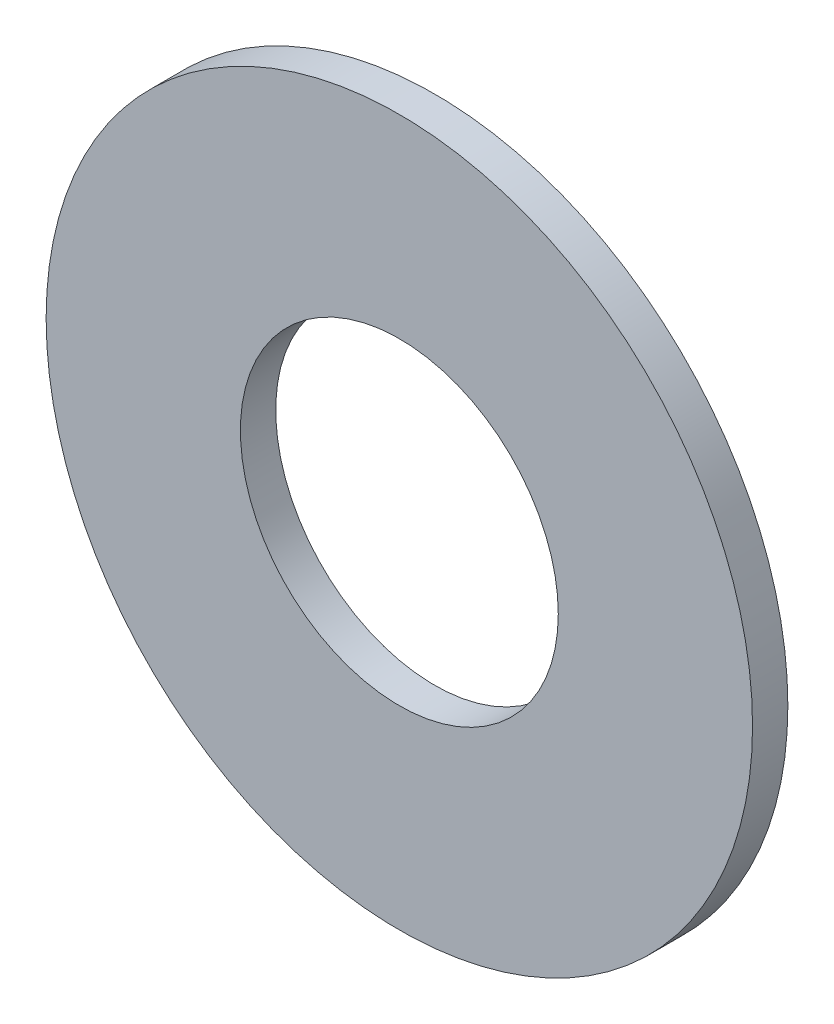
ISO-10303-21;
HEADER;
FILE_DESCRIPTION(('STEP AP214'),'2;1');
FILE_NAME('part.step','',(''),(''),'','','');
FILE_SCHEMA(('AUTOMOTIVE_DESIGN { 1 0 10303 214 1 1 1 1 }'));
ENDSEC;
DATA;
#1=APPLICATION_CONTEXT('core data for automotive mechanical design processes');
#2=APPLICATION_PROTOCOL_DEFINITION('international standard','automotive_design',2000,#1);
#3=PRODUCT_CONTEXT('',#1,'mechanical');
#4=PRODUCT('Part','Part','',(#3));
#5=PRODUCT_RELATED_PRODUCT_CATEGORY('part','',(#4));
#6=PRODUCT_DEFINITION_FORMATION('','',#4);
#7=PRODUCT_DEFINITION_CONTEXT('part definition',#1,'design');
#8=PRODUCT_DEFINITION('design','',#6,#7);
#9=PRODUCT_DEFINITION_SHAPE('','',#8);
#10=(LENGTH_UNIT() NAMED_UNIT(*) SI_UNIT(.MILLI.,.METRE.));
#11=(NAMED_UNIT(*) PLANE_ANGLE_UNIT() SI_UNIT($,.RADIAN.));
#12=(NAMED_UNIT(*) SI_UNIT($,.STERADIAN.) SOLID_ANGLE_UNIT());
#13=UNCERTAINTY_MEASURE_WITH_UNIT(LENGTH_MEASURE(1.E-05),#10,'distance_accuracy_value','');
#14=(GEOMETRIC_REPRESENTATION_CONTEXT(3) GLOBAL_UNCERTAINTY_ASSIGNED_CONTEXT((#13)) GLOBAL_UNIT_ASSIGNED_CONTEXT((#10,
#11,#12)) REPRESENTATION_CONTEXT('',''));
#15=CARTESIAN_POINT('',(0.,0.,0.));
#16=DIRECTION('',(0.,0.,1.));
#17=DIRECTION('',(1.,0.,0.));
#18=AXIS2_PLACEMENT_3D('',#15,#16,#17);
#19=CARTESIAN_POINT('',(0.,0.,-1.));
#20=DIRECTION('',(0.,0.,1.));
#21=DIRECTION('',(1.,0.,0.));
#22=AXIS2_PLACEMENT_3D('',#19,#20,#21);
#23=CYLINDRICAL_SURFACE('',#22,10.);
#24=CARTESIAN_POINT('',(0.,0.,-1.));
#25=DIRECTION('',(0.,0.,1.));
#26=DIRECTION('',(1.,0.,0.));
#27=AXIS2_PLACEMENT_3D('',#24,#25,#26);
#28=CIRCLE('',#27,10.);
#29=CARTESIAN_POINT('',(10.,0.,-1.));
#30=VERTEX_POINT('',#29);
#31=EDGE_CURVE('E10',#30,#30,#28,.T.);
#32=ORIENTED_EDGE('',*,*,#31,.T.);
#33=EDGE_LOOP('',(#32));
#34=FACE_BOUND('',#33,.T.);
#35=CARTESIAN_POINT('',(0.,0.,0.));
#36=DIRECTION('',(0.,0.,1.));
#37=DIRECTION('',(1.,0.,0.));
#38=AXIS2_PLACEMENT_3D('',#35,#36,#37);
#39=CIRCLE('',#38,10.);
#40=CARTESIAN_POINT('',(10.,0.,0.));
#41=VERTEX_POINT('',#40);
#42=EDGE_CURVE('E34',#41,#41,#39,.T.);
#43=ORIENTED_EDGE('',*,*,#42,.F.);
#44=EDGE_LOOP('',(#43));
#45=FACE_BOUND('',#44,.T.);
#46=ADVANCED_FACE('F31',(#34,#45),#23,.T.);
#47=CARTESIAN_POINT('',(0.,0.,-1.));
#48=DIRECTION('',(0.,0.,1.));
#49=DIRECTION('',(1.,0.,0.));
#50=AXIS2_PLACEMENT_3D('',#47,#48,#49);
#51=PLANE('',#50);
#52=CARTESIAN_POINT('',(0.,0.,-1.));
#53=DIRECTION('',(0.,0.,1.));
#54=DIRECTION('',(1.,0.,0.));
#55=AXIS2_PLACEMENT_3D('',#52,#53,#54);
#56=CIRCLE('',#55,4.5);
#57=CARTESIAN_POINT('',(4.5,0.,-1.));
#58=VERTEX_POINT('',#57);
#59=EDGE_CURVE('E41',#58,#58,#56,.T.);
#60=ORIENTED_EDGE('',*,*,#59,.T.);
#61=EDGE_LOOP('',(#60));
#62=FACE_BOUND('',#61,.T.);
#63=ORIENTED_EDGE('',*,*,#31,.F.);
#64=EDGE_LOOP('',(#63));
#65=FACE_BOUND('',#64,.T.);
#66=ADVANCED_FACE('F49',(#62,#65),#51,.F.);
#67=CARTESIAN_POINT('',(0.,0.,0.));
#68=DIRECTION('',(0.,0.,1.));
#69=DIRECTION('',(1.,0.,0.));
#70=AXIS2_PLACEMENT_3D('',#67,#68,#69);
#71=PLANE('',#70);
#72=CARTESIAN_POINT('',(0.,0.,0.));
#73=DIRECTION('',(0.,0.,1.));
#74=DIRECTION('',(1.,0.,0.));
#75=AXIS2_PLACEMENT_3D('',#72,#73,#74);
#76=CIRCLE('',#75,4.5);
#77=CARTESIAN_POINT('',(4.5,0.,0.));
#78=VERTEX_POINT('',#77);
#79=EDGE_CURVE('E43',#78,#78,#76,.T.);
#80=ORIENTED_EDGE('',*,*,#79,.F.);
#81=EDGE_LOOP('',(#80));
#82=FACE_BOUND('',#81,.T.);
#83=ORIENTED_EDGE('',*,*,#42,.T.);
#84=EDGE_LOOP('',(#83));
#85=FACE_BOUND('',#84,.T.);
#86=ADVANCED_FACE('F55',(#82,#85),#71,.T.);
#87=CARTESIAN_POINT('',(0.,0.,-1.));
#88=DIRECTION('',(0.,0.,1.));
#89=DIRECTION('',(1.,0.,0.));
#90=AXIS2_PLACEMENT_3D('',#87,#88,#89);
#91=CYLINDRICAL_SURFACE('',#90,4.5);
#92=ORIENTED_EDGE('',*,*,#59,.F.);
#93=EDGE_LOOP('',(#92));
#94=FACE_BOUND('',#93,.T.);
#95=ORIENTED_EDGE('',*,*,#79,.T.);
#96=EDGE_LOOP('',(#95));
#97=FACE_BOUND('',#96,.T.);
#98=ADVANCED_FACE('F52',(#94,#97),#91,.F.);
#99=CLOSED_SHELL('',(#46,#66,#86,#98));
#100=MANIFOLD_SOLID_BREP('B2',#99);
#101=ADVANCED_BREP_SHAPE_REPRESENTATION('',(#18,#100),#14);
#102=SHAPE_DEFINITION_REPRESENTATION(#9,#101);
ENDSEC;
END-ISO-10303-21;
